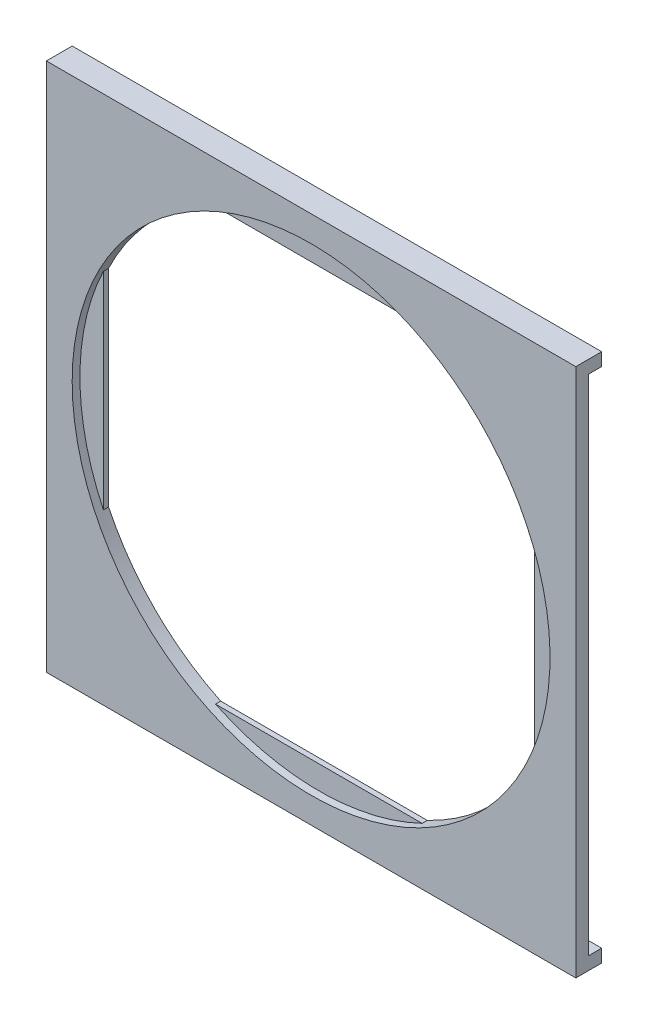
ISO-10303-21;
HEADER;
FILE_DESCRIPTION(('STEP AP214'),'2;1');
FILE_NAME('part.step','',(''),(''),'','','');
FILE_SCHEMA(('AUTOMOTIVE_DESIGN { 1 0 10303 214 1 1 1 1 }'));
ENDSEC;
DATA;
#1=APPLICATION_CONTEXT('core data for automotive mechanical design processes');
#2=APPLICATION_PROTOCOL_DEFINITION('international standard','automotive_design',2000,#1);
#3=PRODUCT_CONTEXT('',#1,'mechanical');
#4=PRODUCT('Part','Part','',(#3));
#5=PRODUCT_RELATED_PRODUCT_CATEGORY('part','',(#4));
#6=PRODUCT_DEFINITION_FORMATION('','',#4);
#7=PRODUCT_DEFINITION_CONTEXT('part definition',#1,'design');
#8=PRODUCT_DEFINITION('design','',#6,#7);
#9=PRODUCT_DEFINITION_SHAPE('','',#8);
#10=(LENGTH_UNIT() NAMED_UNIT(*) SI_UNIT(.MILLI.,.METRE.));
#11=(NAMED_UNIT(*) PLANE_ANGLE_UNIT() SI_UNIT($,.RADIAN.));
#12=(NAMED_UNIT(*) SI_UNIT($,.STERADIAN.) SOLID_ANGLE_UNIT());
#13=UNCERTAINTY_MEASURE_WITH_UNIT(LENGTH_MEASURE(1.E-05),#10,'distance_accuracy_value','');
#14=(GEOMETRIC_REPRESENTATION_CONTEXT(3) GLOBAL_UNCERTAINTY_ASSIGNED_CONTEXT((#13)) GLOBAL_UNIT_ASSIGNED_CONTEXT((#10,
#11,#12)) REPRESENTATION_CONTEXT('',''));
#15=CARTESIAN_POINT('',(0.,0.,0.));
#16=DIRECTION('',(0.,0.,1.));
#17=DIRECTION('',(1.,0.,0.));
#18=AXIS2_PLACEMENT_3D('',#15,#16,#17);
#19=CARTESIAN_POINT('',(0.,0.,-2.));
#20=DIRECTION('',(0.,0.,-1.));
#21=DIRECTION('',(-1.,0.,0.));
#22=AXIS2_PLACEMENT_3D('',#19,#20,#21);
#23=PLANE('',#22);
#24=CARTESIAN_POINT('',(191.,209.,-2.));
#25=DIRECTION('',(0.,0.,-1.));
#26=DIRECTION('',(-1.,0.,0.));
#27=AXIS2_PLACEMENT_3D('',#24,#25,#26);
#28=CIRCLE('',#27,92.5);
#29=CARTESIAN_POINT('',(231.,292.404136588061,-2.));
#30=VERTEX_POINT('',#29);
#31=CARTESIAN_POINT('',(274.404136588062,249.,-2.));
#32=VERTEX_POINT('',#31);
#33=EDGE_CURVE('E304',#30,#32,#28,.T.);
#34=ORIENTED_EDGE('',*,*,#33,.F.);
#35=DIRECTION('',(-1.,0.,0.));
#36=VECTOR('',#35,1.);
#37=CARTESIAN_POINT('',(231.,292.404136588061,-2.));
#38=LINE('',#37,#36);
#39=CARTESIAN_POINT('',(151.,292.404136588061,-2.));
#40=VERTEX_POINT('',#39);
#41=EDGE_CURVE('E281',#30,#40,#38,.T.);
#42=ORIENTED_EDGE('',*,*,#41,.T.);
#43=CARTESIAN_POINT('',(107.595863411939,249.000000000001,-2.));
#44=VERTEX_POINT('',#43);
#45=EDGE_CURVE('E308',#44,#40,#28,.T.);
#46=ORIENTED_EDGE('',*,*,#45,.F.);
#47=DIRECTION('',(0.,-1.,0.));
#48=VECTOR('',#47,1.);
#49=CARTESIAN_POINT('',(107.595863411939,249.000000000001,-2.));
#50=LINE('',#49,#48);
#51=CARTESIAN_POINT('',(107.595863411938,169.000000000001,-2.));
#52=VERTEX_POINT('',#51);
#53=EDGE_CURVE('E227',#44,#52,#50,.T.);
#54=ORIENTED_EDGE('',*,*,#53,.T.);
#55=CARTESIAN_POINT('',(151.,125.595863411939,-2.));
#56=VERTEX_POINT('',#55);
#57=EDGE_CURVE('E662',#56,#52,#28,.T.);
#58=ORIENTED_EDGE('',*,*,#57,.F.);
#59=DIRECTION('',(1.,0.,0.));
#60=VECTOR('',#59,1.);
#61=CARTESIAN_POINT('',(151.,125.595863411939,-2.));
#62=LINE('',#61,#60);
#63=CARTESIAN_POINT('',(231.,125.595863411939,-2.));
#64=VERTEX_POINT('',#63);
#65=EDGE_CURVE('E243',#56,#64,#62,.T.);
#66=ORIENTED_EDGE('',*,*,#65,.T.);
#67=CARTESIAN_POINT('',(274.404136588061,169.,-2.));
#68=VERTEX_POINT('',#67);
#69=EDGE_CURVE('E307',#68,#64,#28,.T.);
#70=ORIENTED_EDGE('',*,*,#69,.F.);
#71=DIRECTION('',(0.,1.,0.));
#72=VECTOR('',#71,1.);
#73=CARTESIAN_POINT('',(274.404136588061,169.,-2.));
#74=LINE('',#73,#72);
#75=EDGE_CURVE('E262',#68,#32,#74,.T.);
#76=ORIENTED_EDGE('',*,*,#75,.T.);
#77=EDGE_LOOP('',(#34,#42,#46,#54,#58,#66,#70,#76));
#78=FACE_BOUND('',#77,.T.);
#79=DIRECTION('',(0.,1.,0.));
#80=VECTOR('',#79,1.);
#81=CARTESIAN_POINT('',(293.5,0.,-2.));
#82=LINE('',#81,#80);
#83=CARTESIAN_POINT('',(293.5,111.5,-2.));
#84=VERTEX_POINT('',#83);
#85=CARTESIAN_POINT('',(293.5,306.5,-2.));
#86=VERTEX_POINT('',#85);
#87=EDGE_CURVE('E76',#84,#86,#82,.T.);
#88=ORIENTED_EDGE('',*,*,#87,.F.);
#89=DIRECTION('',(1.,0.,0.));
#90=VECTOR('',#89,1.);
#91=CARTESIAN_POINT('',(88.5,111.5,-2.));
#92=LINE('',#91,#90);
#93=CARTESIAN_POINT('',(88.5,111.5,-2.));
#94=VERTEX_POINT('',#93);
#95=EDGE_CURVE('E71',#94,#84,#92,.T.);
#96=ORIENTED_EDGE('',*,*,#95,.F.);
#97=DIRECTION('',(0.,1.,0.));
#98=VECTOR('',#97,1.);
#99=CARTESIAN_POINT('',(88.5,0.,-2.));
#100=LINE('',#99,#98);
#101=CARTESIAN_POINT('',(88.5,306.5,-2.));
#102=VERTEX_POINT('',#101);
#103=EDGE_CURVE('E311',#94,#102,#100,.T.);
#104=ORIENTED_EDGE('',*,*,#103,.T.);
#105=DIRECTION('',(-1.,0.,0.));
#106=VECTOR('',#105,1.);
#107=CARTESIAN_POINT('',(293.5,306.5,-2.));
#108=LINE('',#107,#106);
#109=EDGE_CURVE('E196',#86,#102,#108,.T.);
#110=ORIENTED_EDGE('',*,*,#109,.F.);
#111=EDGE_LOOP('',(#88,#96,#104,#110));
#112=FACE_BOUND('',#111,.T.);
#113=ADVANCED_FACE('F55',(#78,#112),#23,.T.);
#114=CARTESIAN_POINT('',(293.5,0.,-2.));
#115=DIRECTION('',(1.,0.,0.));
#116=DIRECTION('',(0.,0.,-1.));
#117=AXIS2_PLACEMENT_3D('',#114,#115,#116);
#118=PLANE('',#117);
#119=DIRECTION('',(0.,1.,0.));
#120=VECTOR('',#119,1.);
#121=CARTESIAN_POINT('',(293.5,0.,3.));
#122=LINE('',#121,#120);
#123=CARTESIAN_POINT('',(293.5,106.5,3.));
#124=VERTEX_POINT('',#123);
#125=CARTESIAN_POINT('',(293.5,311.5,3.));
#126=VERTEX_POINT('',#125);
#127=EDGE_CURVE('E318',#124,#126,#122,.T.);
#128=ORIENTED_EDGE('',*,*,#127,.F.);
#129=DIRECTION('',(0.,0.,1.));
#130=VECTOR('',#129,1.);
#131=CARTESIAN_POINT('',(293.5,106.5,-2.));
#132=LINE('',#131,#130);
#133=CARTESIAN_POINT('',(293.5,106.5,-7.));
#134=VERTEX_POINT('',#133);
#135=EDGE_CURVE('E11',#134,#124,#132,.T.);
#136=ORIENTED_EDGE('',*,*,#135,.F.);
#137=DIRECTION('',(0.,-1.,0.));
#138=VECTOR('',#137,1.);
#139=CARTESIAN_POINT('',(293.5,106.5,-7.));
#140=LINE('',#139,#138);
#141=CARTESIAN_POINT('',(293.5,111.5,-7.));
#142=VERTEX_POINT('',#141);
#143=EDGE_CURVE('E184',#142,#134,#140,.T.);
#144=ORIENTED_EDGE('',*,*,#143,.F.);
#145=DIRECTION('',(0.,0.,1.));
#146=VECTOR('',#145,1.);
#147=CARTESIAN_POINT('',(293.5,111.5,-7.));
#148=LINE('',#147,#146);
#149=EDGE_CURVE('E186',#142,#84,#148,.T.);
#150=ORIENTED_EDGE('',*,*,#149,.T.);
#151=ORIENTED_EDGE('',*,*,#87,.T.);
#152=DIRECTION('',(0.,0.,1.));
#153=VECTOR('',#152,1.);
#154=CARTESIAN_POINT('',(293.5,306.5,-7.));
#155=LINE('',#154,#153);
#156=CARTESIAN_POINT('',(293.5,306.5,-7.));
#157=VERTEX_POINT('',#156);
#158=EDGE_CURVE('E223',#157,#86,#155,.T.);
#159=ORIENTED_EDGE('',*,*,#158,.F.);
#160=DIRECTION('',(0.,-1.,0.));
#161=VECTOR('',#160,1.);
#162=CARTESIAN_POINT('',(293.5,311.5,-7.));
#163=LINE('',#162,#161);
#164=CARTESIAN_POINT('',(293.5,311.5,-7.));
#165=VERTEX_POINT('',#164);
#166=EDGE_CURVE('E201',#165,#157,#163,.T.);
#167=ORIENTED_EDGE('',*,*,#166,.F.);
#168=DIRECTION('',(0.,0.,1.));
#169=VECTOR('',#168,1.);
#170=CARTESIAN_POINT('',(293.5,311.5,-2.));
#171=LINE('',#170,#169);
#172=EDGE_CURVE('E314',#165,#126,#171,.T.);
#173=ORIENTED_EDGE('',*,*,#172,.T.);
#174=EDGE_LOOP('',(#128,#136,#144,#150,#151,#159,#167,#173));
#175=FACE_BOUND('',#174,.T.);
#176=ADVANCED_FACE('F343',(#175),#118,.T.);
#177=CARTESIAN_POINT('',(0.,106.5,-2.));
#178=DIRECTION('',(0.,1.,0.));
#179=DIRECTION('',(0.,0.,1.));
#180=AXIS2_PLACEMENT_3D('',#177,#178,#179);
#181=PLANE('',#180);
#182=DIRECTION('',(-1.,0.,0.));
#183=VECTOR('',#182,1.);
#184=CARTESIAN_POINT('',(0.,106.5,3.));
#185=LINE('',#184,#183);
#186=CARTESIAN_POINT('',(88.5,106.5,3.));
#187=VERTEX_POINT('',#186);
#188=EDGE_CURVE('E171',#124,#187,#185,.T.);
#189=ORIENTED_EDGE('',*,*,#188,.T.);
#190=DIRECTION('',(0.,0.,1.));
#191=VECTOR('',#190,1.);
#192=CARTESIAN_POINT('',(88.5,106.5,-2.));
#193=LINE('',#192,#191);
#194=CARTESIAN_POINT('',(88.5,106.5,-7.));
#195=VERTEX_POINT('',#194);
#196=EDGE_CURVE('E64',#195,#187,#193,.T.);
#197=ORIENTED_EDGE('',*,*,#196,.F.);
#198=DIRECTION('',(-1.,0.,0.));
#199=VECTOR('',#198,1.);
#200=CARTESIAN_POINT('',(88.5,106.5,-7.));
#201=LINE('',#200,#199);
#202=EDGE_CURVE('E169',#134,#195,#201,.T.);
#203=ORIENTED_EDGE('',*,*,#202,.F.);
#204=ORIENTED_EDGE('',*,*,#135,.T.);
#205=EDGE_LOOP('',(#189,#197,#203,#204));
#206=FACE_BOUND('',#205,.T.);
#207=ADVANCED_FACE('F168',(#206),#181,.F.);
#208=CARTESIAN_POINT('',(88.5,0.,-2.));
#209=DIRECTION('',(1.,0.,0.));
#210=DIRECTION('',(0.,1.,0.));
#211=AXIS2_PLACEMENT_3D('',#208,#209,#210);
#212=PLANE('',#211);
#213=DIRECTION('',(0.,1.,0.));
#214=VECTOR('',#213,1.);
#215=CARTESIAN_POINT('',(88.5,0.,3.));
#216=LINE('',#215,#214);
#217=CARTESIAN_POINT('',(88.5,311.5,3.));
#218=VERTEX_POINT('',#217);
#219=EDGE_CURVE('E324',#187,#218,#216,.T.);
#220=ORIENTED_EDGE('',*,*,#219,.T.);
#221=DIRECTION('',(0.,0.,1.));
#222=VECTOR('',#221,1.);
#223=CARTESIAN_POINT('',(88.5,311.5,-2.));
#224=LINE('',#223,#222);
#225=CARTESIAN_POINT('',(88.5,311.5,-7.));
#226=VERTEX_POINT('',#225);
#227=EDGE_CURVE('E176',#226,#218,#224,.T.);
#228=ORIENTED_EDGE('',*,*,#227,.F.);
#229=DIRECTION('',(0.,1.,0.));
#230=VECTOR('',#229,1.);
#231=CARTESIAN_POINT('',(88.5,311.5,-7.));
#232=LINE('',#231,#230);
#233=CARTESIAN_POINT('',(88.5,306.5,-7.));
#234=VERTEX_POINT('',#233);
#235=EDGE_CURVE('E208',#234,#226,#232,.T.);
#236=ORIENTED_EDGE('',*,*,#235,.F.);
#237=DIRECTION('',(0.,0.,1.));
#238=VECTOR('',#237,1.);
#239=CARTESIAN_POINT('',(88.5,306.5,-7.));
#240=LINE('',#239,#238);
#241=EDGE_CURVE('E216',#234,#102,#240,.T.);
#242=ORIENTED_EDGE('',*,*,#241,.T.);
#243=ORIENTED_EDGE('',*,*,#103,.F.);
#244=DIRECTION('',(0.,0.,1.));
#245=VECTOR('',#244,1.);
#246=CARTESIAN_POINT('',(88.5,111.5,-7.));
#247=LINE('',#246,#245);
#248=CARTESIAN_POINT('',(88.5,111.5,-7.));
#249=VERTEX_POINT('',#248);
#250=EDGE_CURVE('E190',#249,#94,#247,.T.);
#251=ORIENTED_EDGE('',*,*,#250,.F.);
#252=DIRECTION('',(0.,1.,0.));
#253=VECTOR('',#252,1.);
#254=CARTESIAN_POINT('',(88.5,106.5,-7.));
#255=LINE('',#254,#253);
#256=EDGE_CURVE('E181',#195,#249,#255,.T.);
#257=ORIENTED_EDGE('',*,*,#256,.F.);
#258=ORIENTED_EDGE('',*,*,#196,.T.);
#259=EDGE_LOOP('',(#220,#228,#236,#242,#243,#251,#257,#258));
#260=FACE_BOUND('',#259,.T.);
#261=ADVANCED_FACE('F188',(#260),#212,.F.);
#262=CARTESIAN_POINT('',(191.,209.,-2.));
#263=DIRECTION('',(0.,0.,1.));
#264=DIRECTION('',(1.,0.,0.));
#265=AXIS2_PLACEMENT_3D('',#262,#263,#264);
#266=CYLINDRICAL_SURFACE('',#265,92.5);
#267=DIRECTION('',(0.,0.,-1.));
#268=VECTOR('',#267,1.);
#269=CARTESIAN_POINT('',(107.595863411939,249.000000000001,0.));
#270=LINE('',#269,#268);
#271=CARTESIAN_POINT('',(107.595863411939,249.000000000001,0.));
#272=VERTEX_POINT('',#271);
#273=EDGE_CURVE('E235',#272,#44,#270,.T.);
#274=ORIENTED_EDGE('',*,*,#273,.T.);
#275=ORIENTED_EDGE('',*,*,#45,.T.);
#276=DIRECTION('',(0.,0.,-1.));
#277=VECTOR('',#276,1.);
#278=CARTESIAN_POINT('',(151.,292.404136588061,0.));
#279=LINE('',#278,#277);
#280=CARTESIAN_POINT('',(151.,292.404136588061,0.));
#281=VERTEX_POINT('',#280);
#282=EDGE_CURVE('E296',#281,#40,#279,.T.);
#283=ORIENTED_EDGE('',*,*,#282,.F.);
#284=CARTESIAN_POINT('',(191.,209.,0.));
#285=DIRECTION('',(0.,0.,-1.));
#286=DIRECTION('',(-1.,0.,0.));
#287=AXIS2_PLACEMENT_3D('',#284,#285,#286);
#288=CIRCLE('',#287,92.5);
#289=CARTESIAN_POINT('',(231.,292.404136588061,0.));
#290=VERTEX_POINT('',#289);
#291=EDGE_CURVE('E285',#281,#290,#288,.T.);
#292=ORIENTED_EDGE('',*,*,#291,.T.);
#293=DIRECTION('',(0.,0.,-1.));
#294=VECTOR('',#293,1.);
#295=CARTESIAN_POINT('',(231.,292.404136588061,0.));
#296=LINE('',#295,#294);
#297=EDGE_CURVE('E292',#290,#30,#296,.T.);
#298=ORIENTED_EDGE('',*,*,#297,.T.);
#299=ORIENTED_EDGE('',*,*,#33,.T.);
#300=DIRECTION('',(0.,0.,-1.));
#301=VECTOR('',#300,1.);
#302=CARTESIAN_POINT('',(274.404136588062,249.,0.));
#303=LINE('',#302,#301);
#304=CARTESIAN_POINT('',(274.404136588062,249.,0.));
#305=VERTEX_POINT('',#304);
#306=EDGE_CURVE('E277',#305,#32,#303,.T.);
#307=ORIENTED_EDGE('',*,*,#306,.F.);
#308=CARTESIAN_POINT('',(191.,209.,0.));
#309=DIRECTION('',(0.,0.,-1.));
#310=DIRECTION('',(0.,1.,0.));
#311=AXIS2_PLACEMENT_3D('',#308,#309,#310);
#312=CIRCLE('',#311,92.5);
#313=CARTESIAN_POINT('',(274.404136588061,169.,0.));
#314=VERTEX_POINT('',#313);
#315=EDGE_CURVE('E266',#305,#314,#312,.T.);
#316=ORIENTED_EDGE('',*,*,#315,.T.);
#317=DIRECTION('',(0.,0.,-1.));
#318=VECTOR('',#317,1.);
#319=CARTESIAN_POINT('',(274.404136588061,169.,0.));
#320=LINE('',#319,#318);
#321=EDGE_CURVE('E273',#314,#68,#320,.T.);
#322=ORIENTED_EDGE('',*,*,#321,.T.);
#323=ORIENTED_EDGE('',*,*,#69,.T.);
#324=DIRECTION('',(0.,0.,-1.));
#325=VECTOR('',#324,1.);
#326=CARTESIAN_POINT('',(231.,125.595863411939,0.));
#327=LINE('',#326,#325);
#328=CARTESIAN_POINT('',(231.,125.595863411939,0.));
#329=VERTEX_POINT('',#328);
#330=EDGE_CURVE('E258',#329,#64,#327,.T.);
#331=ORIENTED_EDGE('',*,*,#330,.F.);
#332=CARTESIAN_POINT('',(191.,209.,0.));
#333=DIRECTION('',(0.,0.,-1.));
#334=DIRECTION('',(1.,0.,0.));
#335=AXIS2_PLACEMENT_3D('',#332,#333,#334);
#336=CIRCLE('',#335,92.5);
#337=CARTESIAN_POINT('',(151.,125.595863411939,0.));
#338=VERTEX_POINT('',#337);
#339=EDGE_CURVE('E247',#329,#338,#336,.T.);
#340=ORIENTED_EDGE('',*,*,#339,.T.);
#341=DIRECTION('',(0.,0.,-1.));
#342=VECTOR('',#341,1.);
#343=CARTESIAN_POINT('',(151.,125.595863411939,0.));
#344=LINE('',#343,#342);
#345=EDGE_CURVE('E254',#338,#56,#344,.T.);
#346=ORIENTED_EDGE('',*,*,#345,.T.);
#347=ORIENTED_EDGE('',*,*,#57,.T.);
#348=DIRECTION('',(0.,0.,-1.));
#349=VECTOR('',#348,1.);
#350=CARTESIAN_POINT('',(107.595863411938,169.000000000001,0.));
#351=LINE('',#350,#349);
#352=CARTESIAN_POINT('',(107.595863411938,169.000000000001,0.));
#353=VERTEX_POINT('',#352);
#354=EDGE_CURVE('E239',#353,#52,#351,.T.);
#355=ORIENTED_EDGE('',*,*,#354,.F.);
#356=CARTESIAN_POINT('',(191.,209.,0.));
#357=DIRECTION('',(0.,0.,-1.));
#358=DIRECTION('',(0.,-1.,0.));
#359=AXIS2_PLACEMENT_3D('',#356,#357,#358);
#360=CIRCLE('',#359,92.5);
#361=EDGE_CURVE('E228',#353,#272,#360,.T.);
#362=ORIENTED_EDGE('',*,*,#361,.T.);
#363=EDGE_LOOP('',(#274,#275,#283,#292,#298,#299,#307,#316,#322,#323,#331,#340,#346,#347,#355,#362));
#364=FACE_BOUND('',#363,.T.);
#365=CARTESIAN_POINT('',(191.,209.,3.));
#366=DIRECTION('',(0.,0.,-1.));
#367=DIRECTION('',(-1.,0.,0.));
#368=AXIS2_PLACEMENT_3D('',#365,#366,#367);
#369=CIRCLE('',#368,92.5);
#370=CARTESIAN_POINT('',(98.5,209.,3.));
#371=VERTEX_POINT('',#370);
#372=EDGE_CURVE('E300',#371,#371,#369,.T.);
#373=ORIENTED_EDGE('',*,*,#372,.F.);
#374=EDGE_LOOP('',(#373));
#375=FACE_BOUND('',#374,.T.);
#376=ADVANCED_FACE('F57',(#364,#375),#266,.F.);
#377=CARTESIAN_POINT('',(0.,311.5,-2.));
#378=DIRECTION('',(0.,1.,0.));
#379=DIRECTION('',(0.,0.,1.));
#380=AXIS2_PLACEMENT_3D('',#377,#378,#379);
#381=PLANE('',#380);
#382=DIRECTION('',(-1.,0.,0.));
#383=VECTOR('',#382,1.);
#384=CARTESIAN_POINT('',(0.,311.5,3.));
#385=LINE('',#384,#383);
#386=EDGE_CURVE('E327',#126,#218,#385,.T.);
#387=ORIENTED_EDGE('',*,*,#386,.F.);
#388=ORIENTED_EDGE('',*,*,#172,.F.);
#389=DIRECTION('',(1.,0.,0.));
#390=VECTOR('',#389,1.);
#391=CARTESIAN_POINT('',(293.5,311.5,-7.));
#392=LINE('',#391,#390);
#393=EDGE_CURVE('E212',#226,#165,#392,.T.);
#394=ORIENTED_EDGE('',*,*,#393,.F.);
#395=ORIENTED_EDGE('',*,*,#227,.T.);
#396=EDGE_LOOP('',(#387,#388,#394,#395));
#397=FACE_BOUND('',#396,.T.);
#398=ADVANCED_FACE('F337',(#397),#381,.T.);
#399=CARTESIAN_POINT('',(0.,0.,3.));
#400=DIRECTION('',(0.,0.,-1.));
#401=DIRECTION('',(-1.,0.,0.));
#402=AXIS2_PLACEMENT_3D('',#399,#400,#401);
#403=PLANE('',#402);
#404=ORIENTED_EDGE('',*,*,#372,.T.);
#405=EDGE_LOOP('',(#404));
#406=FACE_BOUND('',#405,.T.);
#407=ORIENTED_EDGE('',*,*,#127,.T.);
#408=ORIENTED_EDGE('',*,*,#386,.T.);
#409=ORIENTED_EDGE('',*,*,#219,.F.);
#410=ORIENTED_EDGE('',*,*,#188,.F.);
#411=EDGE_LOOP('',(#407,#408,#409,#410));
#412=FACE_BOUND('',#411,.T.);
#413=ADVANCED_FACE('F340',(#406,#412),#403,.F.);
#414=CARTESIAN_POINT('',(231.,292.404136588061,0.));
#415=DIRECTION('',(0.,-1.,0.));
#416=DIRECTION('',(0.,0.,-1.));
#417=AXIS2_PLACEMENT_3D('',#414,#415,#416);
#418=PLANE('',#417);
#419=ORIENTED_EDGE('',*,*,#41,.F.);
#420=ORIENTED_EDGE('',*,*,#297,.F.);
#421=DIRECTION('',(-1.,0.,0.));
#422=VECTOR('',#421,1.);
#423=CARTESIAN_POINT('',(231.,292.404136588061,0.));
#424=LINE('',#423,#422);
#425=EDGE_CURVE('E288',#290,#281,#424,.T.);
#426=ORIENTED_EDGE('',*,*,#425,.T.);
#427=ORIENTED_EDGE('',*,*,#282,.T.);
#428=EDGE_LOOP('',(#419,#420,#426,#427));
#429=FACE_BOUND('',#428,.T.);
#430=ADVANCED_FACE('F359',(#429),#418,.T.);
#431=CARTESIAN_POINT('',(191.,209.,0.));
#432=DIRECTION('',(0.,0.,-1.));
#433=DIRECTION('',(-1.,0.,0.));
#434=AXIS2_PLACEMENT_3D('',#431,#432,#433);
#435=PLANE('',#434);
#436=ORIENTED_EDGE('',*,*,#291,.F.);
#437=ORIENTED_EDGE('',*,*,#425,.F.);
#438=EDGE_LOOP('',(#436,#437));
#439=FACE_BOUND('',#438,.T.);
#440=ADVANCED_FACE('F397',(#439),#435,.F.);
#441=CARTESIAN_POINT('',(274.404136588061,169.,0.));
#442=DIRECTION('',(-1.,0.,0.));
#443=DIRECTION('',(0.,-1.,0.));
#444=AXIS2_PLACEMENT_3D('',#441,#442,#443);
#445=PLANE('',#444);
#446=ORIENTED_EDGE('',*,*,#75,.F.);
#447=ORIENTED_EDGE('',*,*,#321,.F.);
#448=DIRECTION('',(0.,1.,0.));
#449=VECTOR('',#448,1.);
#450=CARTESIAN_POINT('',(274.404136588061,169.,0.));
#451=LINE('',#450,#449);
#452=EDGE_CURVE('E269',#314,#305,#451,.T.);
#453=ORIENTED_EDGE('',*,*,#452,.T.);
#454=ORIENTED_EDGE('',*,*,#306,.T.);
#455=EDGE_LOOP('',(#446,#447,#453,#454));
#456=FACE_BOUND('',#455,.T.);
#457=ADVANCED_FACE('F404',(#456),#445,.T.);
#458=CARTESIAN_POINT('',(191.,209.,0.));
#459=DIRECTION('',(0.,0.,-1.));
#460=DIRECTION('',(0.,1.,0.));
#461=AXIS2_PLACEMENT_3D('',#458,#459,#460);
#462=PLANE('',#461);
#463=ORIENTED_EDGE('',*,*,#315,.F.);
#464=ORIENTED_EDGE('',*,*,#452,.F.);
#465=EDGE_LOOP('',(#463,#464));
#466=FACE_BOUND('',#465,.T.);
#467=ADVANCED_FACE('F411',(#466),#462,.F.);
#468=CARTESIAN_POINT('',(151.,125.595863411939,0.));
#469=DIRECTION('',(0.,1.,0.));
#470=DIRECTION('',(0.,0.,1.));
#471=AXIS2_PLACEMENT_3D('',#468,#469,#470);
#472=PLANE('',#471);
#473=ORIENTED_EDGE('',*,*,#65,.F.);
#474=ORIENTED_EDGE('',*,*,#345,.F.);
#475=DIRECTION('',(1.,0.,0.));
#476=VECTOR('',#475,1.);
#477=CARTESIAN_POINT('',(151.,125.595863411939,0.));
#478=LINE('',#477,#476);
#479=EDGE_CURVE('E250',#338,#329,#478,.T.);
#480=ORIENTED_EDGE('',*,*,#479,.T.);
#481=ORIENTED_EDGE('',*,*,#330,.T.);
#482=EDGE_LOOP('',(#473,#474,#480,#481));
#483=FACE_BOUND('',#482,.T.);
#484=ADVANCED_FACE('F419',(#483),#472,.T.);
#485=CARTESIAN_POINT('',(191.,209.,0.));
#486=DIRECTION('',(0.,0.,-1.));
#487=DIRECTION('',(1.,0.,0.));
#488=AXIS2_PLACEMENT_3D('',#485,#486,#487);
#489=PLANE('',#488);
#490=ORIENTED_EDGE('',*,*,#339,.F.);
#491=ORIENTED_EDGE('',*,*,#479,.F.);
#492=EDGE_LOOP('',(#490,#491));
#493=FACE_BOUND('',#492,.T.);
#494=ADVANCED_FACE('F427',(#493),#489,.F.);
#495=CARTESIAN_POINT('',(107.595863411939,249.000000000001,0.));
#496=DIRECTION('',(1.,0.,0.));
#497=DIRECTION('',(0.,1.,0.));
#498=AXIS2_PLACEMENT_3D('',#495,#496,#497);
#499=PLANE('',#498);
#500=ORIENTED_EDGE('',*,*,#53,.F.);
#501=ORIENTED_EDGE('',*,*,#273,.F.);
#502=DIRECTION('',(0.,-1.,0.));
#503=VECTOR('',#502,1.);
#504=CARTESIAN_POINT('',(107.595863411939,249.000000000001,0.));
#505=LINE('',#504,#503);
#506=EDGE_CURVE('E231',#272,#353,#505,.T.);
#507=ORIENTED_EDGE('',*,*,#506,.T.);
#508=ORIENTED_EDGE('',*,*,#354,.T.);
#509=EDGE_LOOP('',(#500,#501,#507,#508));
#510=FACE_BOUND('',#509,.T.);
#511=ADVANCED_FACE('F435',(#510),#499,.T.);
#512=CARTESIAN_POINT('',(191.,209.,0.));
#513=DIRECTION('',(0.,0.,-1.));
#514=DIRECTION('',(0.,-1.,0.));
#515=AXIS2_PLACEMENT_3D('',#512,#513,#514);
#516=PLANE('',#515);
#517=ORIENTED_EDGE('',*,*,#361,.F.);
#518=ORIENTED_EDGE('',*,*,#506,.F.);
#519=EDGE_LOOP('',(#517,#518));
#520=FACE_BOUND('',#519,.T.);
#521=ADVANCED_FACE('F443',(#520),#516,.F.);
#522=CARTESIAN_POINT('',(293.5,306.5,-7.));
#523=DIRECTION('',(0.,1.,0.));
#524=DIRECTION('',(0.,0.,1.));
#525=AXIS2_PLACEMENT_3D('',#522,#523,#524);
#526=PLANE('',#525);
#527=ORIENTED_EDGE('',*,*,#109,.T.);
#528=ORIENTED_EDGE('',*,*,#241,.F.);
#529=DIRECTION('',(-1.,0.,0.));
#530=VECTOR('',#529,1.);
#531=CARTESIAN_POINT('',(293.5,306.5,-7.));
#532=LINE('',#531,#530);
#533=EDGE_CURVE('E205',#157,#234,#532,.T.);
#534=ORIENTED_EDGE('',*,*,#533,.F.);
#535=ORIENTED_EDGE('',*,*,#158,.T.);
#536=EDGE_LOOP('',(#527,#528,#534,#535));
#537=FACE_BOUND('',#536,.T.);
#538=ADVANCED_FACE('F350',(#537),#526,.F.);
#539=CARTESIAN_POINT('',(0.,0.,-7.));
#540=DIRECTION('',(0.,0.,-1.));
#541=DIRECTION('',(-1.,0.,0.));
#542=AXIS2_PLACEMENT_3D('',#539,#540,#541);
#543=PLANE('',#542);
#544=ORIENTED_EDGE('',*,*,#166,.T.);
#545=ORIENTED_EDGE('',*,*,#533,.T.);
#546=ORIENTED_EDGE('',*,*,#235,.T.);
#547=ORIENTED_EDGE('',*,*,#393,.T.);
#548=EDGE_LOOP('',(#544,#545,#546,#547));
#549=FACE_BOUND('',#548,.T.);
#550=ADVANCED_FACE('F347',(#549),#543,.T.);
#551=CARTESIAN_POINT('',(88.5,111.5,-7.));
#552=DIRECTION('',(0.,-1.,0.));
#553=DIRECTION('',(1.,0.,0.));
#554=AXIS2_PLACEMENT_3D('',#551,#552,#553);
#555=PLANE('',#554);
#556=ORIENTED_EDGE('',*,*,#95,.T.);
#557=ORIENTED_EDGE('',*,*,#149,.F.);
#558=DIRECTION('',(1.,0.,0.));
#559=VECTOR('',#558,1.);
#560=CARTESIAN_POINT('',(88.5,111.5,-7.));
#561=LINE('',#560,#559);
#562=EDGE_CURVE('E192',#249,#142,#561,.T.);
#563=ORIENTED_EDGE('',*,*,#562,.F.);
#564=ORIENTED_EDGE('',*,*,#250,.T.);
#565=EDGE_LOOP('',(#556,#557,#563,#564));
#566=FACE_BOUND('',#565,.T.);
#567=ADVANCED_FACE('F544',(#566),#555,.F.);
#568=CARTESIAN_POINT('',(0.,0.,-7.));
#569=DIRECTION('',(0.,0.,-1.));
#570=DIRECTION('',(-1.,0.,0.));
#571=AXIS2_PLACEMENT_3D('',#568,#569,#570);
#572=PLANE('',#571);
#573=ORIENTED_EDGE('',*,*,#256,.T.);
#574=ORIENTED_EDGE('',*,*,#562,.T.);
#575=ORIENTED_EDGE('',*,*,#143,.T.);
#576=ORIENTED_EDGE('',*,*,#202,.T.);
#577=EDGE_LOOP('',(#573,#574,#575,#576));
#578=FACE_BOUND('',#577,.T.);
#579=ADVANCED_FACE('F180',(#578),#572,.T.);
#580=CLOSED_SHELL('',(#113,#176,#207,#261,#376,#398,#413,#430,#440,#457,#467,#484,#494,#511,
#521,#538,#550,#567,#579));
#581=MANIFOLD_SOLID_BREP('B2',#580);
#582=ADVANCED_BREP_SHAPE_REPRESENTATION('',(#18,#581),#14);
#583=SHAPE_DEFINITION_REPRESENTATION(#9,#582);
ENDSEC;
END-ISO-10303-21;
